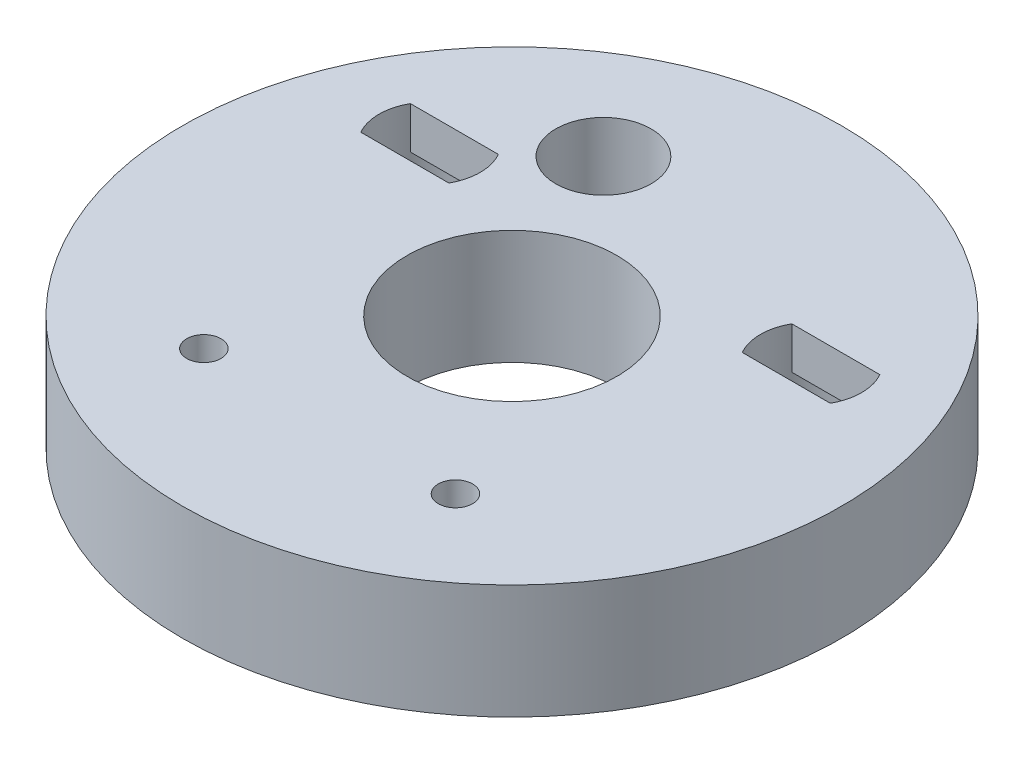
ISO-10303-21;
HEADER;
FILE_DESCRIPTION(('STEP AP214'),'2;1');
FILE_NAME('part.step','',(''),(''),'','','');
FILE_SCHEMA(('AUTOMOTIVE_DESIGN { 1 0 10303 214 1 1 1 1 }'));
ENDSEC;
DATA;
#1=APPLICATION_CONTEXT('core data for automotive mechanical design processes');
#2=APPLICATION_PROTOCOL_DEFINITION('international standard','automotive_design',2000,#1);
#3=PRODUCT_CONTEXT('',#1,'mechanical');
#4=PRODUCT('Part','Part','',(#3));
#5=PRODUCT_RELATED_PRODUCT_CATEGORY('part','',(#4));
#6=PRODUCT_DEFINITION_FORMATION('','',#4);
#7=PRODUCT_DEFINITION_CONTEXT('part definition',#1,'design');
#8=PRODUCT_DEFINITION('design','',#6,#7);
#9=PRODUCT_DEFINITION_SHAPE('','',#8);
#10=(LENGTH_UNIT() NAMED_UNIT(*) SI_UNIT(.MILLI.,.METRE.));
#11=(NAMED_UNIT(*) PLANE_ANGLE_UNIT() SI_UNIT($,.RADIAN.));
#12=(NAMED_UNIT(*) SI_UNIT($,.STERADIAN.) SOLID_ANGLE_UNIT());
#13=UNCERTAINTY_MEASURE_WITH_UNIT(LENGTH_MEASURE(1.E-05),#10,'distance_accuracy_value','');
#14=(GEOMETRIC_REPRESENTATION_CONTEXT(3) GLOBAL_UNCERTAINTY_ASSIGNED_CONTEXT((#13)) GLOBAL_UNIT_ASSIGNED_CONTEXT((#10,
#11,#12)) REPRESENTATION_CONTEXT('',''));
#15=CARTESIAN_POINT('',(0.,0.,0.));
#16=DIRECTION('',(0.,0.,1.));
#17=DIRECTION('',(1.,0.,0.));
#18=AXIS2_PLACEMENT_3D('',#15,#16,#17);
#19=CARTESIAN_POINT('',(0.,0.,0.));
#20=DIRECTION('',(0.,1.,0.));
#21=DIRECTION('',(0.,0.,1.));
#22=AXIS2_PLACEMENT_3D('',#19,#20,#21);
#23=PLANE('',#22);
#24=CARTESIAN_POINT('',(-4.85,0.,-9.64469956572096));
#25=DIRECTION('',(0.,1.,0.));
#26=DIRECTION('',(0.,0.,1.));
#27=AXIS2_PLACEMENT_3D('',#24,#25,#26);
#28=CIRCLE('',#27,2.5);
#29=CARTESIAN_POINT('',(-4.85,0.,-7.14469956572096));
#30=VERTEX_POINT('',#29);
#31=EDGE_CURVE('E173',#30,#30,#28,.T.);
#32=ORIENTED_EDGE('',*,*,#31,.T.);
#33=EDGE_LOOP('',(#32));
#34=FACE_BOUND('',#33,.T.);
#35=CARTESIAN_POINT('',(0.,0.,0.));
#36=DIRECTION('',(0.,1.,0.));
#37=DIRECTION('',(0.,0.,1.));
#38=AXIS2_PLACEMENT_3D('',#35,#36,#37);
#39=CIRCLE('',#38,17.28);
#40=CARTESIAN_POINT('',(0.,0.,-17.28));
#41=VERTEX_POINT('',#40);
#42=EDGE_CURVE('E11',#41,#41,#39,.T.);
#43=ORIENTED_EDGE('',*,*,#42,.F.);
#44=EDGE_LOOP('',(#43));
#45=FACE_BOUND('',#44,.T.);
#46=CARTESIAN_POINT('',(0.,0.,0.));
#47=DIRECTION('',(0.,1.,0.));
#48=DIRECTION('',(0.,0.,1.));
#49=AXIS2_PLACEMENT_3D('',#46,#47,#48);
#50=CIRCLE('',#49,5.5);
#51=CARTESIAN_POINT('',(0.,0.,-5.5));
#52=VERTEX_POINT('',#51);
#53=EDGE_CURVE('E43',#52,#52,#50,.T.);
#54=ORIENTED_EDGE('',*,*,#53,.T.);
#55=EDGE_LOOP('',(#54));
#56=FACE_BOUND('',#55,.T.);
#57=CARTESIAN_POINT('',(-6.595,0.,9.56109165419973));
#58=DIRECTION('',(0.,1.,0.));
#59=DIRECTION('',(0.,0.,1.));
#60=AXIS2_PLACEMENT_3D('',#57,#58,#59);
#61=CIRCLE('',#60,1.9);
#62=CARTESIAN_POINT('',(-6.595,0.,7.66109165419973));
#63=VERTEX_POINT('',#62);
#64=EDGE_CURVE('E195',#63,#63,#61,.T.);
#65=ORIENTED_EDGE('',*,*,#64,.T.);
#66=EDGE_LOOP('',(#65));
#67=FACE_BOUND('',#66,.T.);
#68=CARTESIAN_POINT('',(6.595,0.,9.56109165419973));
#69=DIRECTION('',(0.,1.,0.));
#70=DIRECTION('',(0.,0.,-1.));
#71=AXIS2_PLACEMENT_3D('',#68,#69,#70);
#72=CIRCLE('',#71,1.9);
#73=CARTESIAN_POINT('',(6.595,0.,7.66109165419973));
#74=VERTEX_POINT('',#73);
#75=EDGE_CURVE('E192',#74,#74,#72,.T.);
#76=ORIENTED_EDGE('',*,*,#75,.T.);
#77=EDGE_LOOP('',(#76));
#78=FACE_BOUND('',#77,.T.);
#79=CARTESIAN_POINT('',(10.,0.,-5.67890834580027));
#80=DIRECTION('',(0.,1.,0.));
#81=DIRECTION('',(0.,0.,-1.));
#82=AXIS2_PLACEMENT_3D('',#79,#80,#81);
#83=CIRCLE('',#82,2.65);
#84=CARTESIAN_POINT('',(10.,0.,-8.32890834580027));
#85=VERTEX_POINT('',#84);
#86=EDGE_CURVE('E187',#85,#85,#83,.T.);
#87=ORIENTED_EDGE('',*,*,#86,.T.);
#88=EDGE_LOOP('',(#87));
#89=FACE_BOUND('',#88,.T.);
#90=CARTESIAN_POINT('',(-10.,0.,-5.67890834580027));
#91=DIRECTION('',(0.,1.,0.));
#92=DIRECTION('',(0.,0.,1.));
#93=AXIS2_PLACEMENT_3D('',#90,#91,#92);
#94=CIRCLE('',#93,2.65);
#95=CARTESIAN_POINT('',(-10.,0.,-3.02890834580027));
#96=VERTEX_POINT('',#95);
#97=EDGE_CURVE('E176',#96,#96,#94,.T.);
#98=ORIENTED_EDGE('',*,*,#97,.T.);
#99=EDGE_LOOP('',(#98));
#100=FACE_BOUND('',#99,.T.);
#101=ADVANCED_FACE('F35',(#34,#45,#56,#67,#78,#89,#100),#23,.F.);
#102=CARTESIAN_POINT('',(0.,3.8,0.));
#103=DIRECTION('',(0.,-1.,0.));
#104=DIRECTION('',(0.,0.,-1.));
#105=AXIS2_PLACEMENT_3D('',#102,#103,#104);
#106=CYLINDRICAL_SURFACE('',#105,17.28);
#107=CARTESIAN_POINT('',(0.,6.,0.));
#108=DIRECTION('',(0.,1.,0.));
#109=DIRECTION('',(0.,0.,1.));
#110=AXIS2_PLACEMENT_3D('',#107,#108,#109);
#111=CIRCLE('',#110,17.28);
#112=CARTESIAN_POINT('',(0.,6.,-17.28));
#113=VERTEX_POINT('',#112);
#114=EDGE_CURVE('E169',#113,#113,#111,.T.);
#115=CARTESIAN_POINT('',(0.,0.,-17.28));
#116=CARTESIAN_POINT('',(0.,0.0625000000000001,-17.28));
#117=CARTESIAN_POINT('',(0.,0.125,-17.28));
#118=CARTESIAN_POINT('',(0.,0.25,-17.28));
#119=CARTESIAN_POINT('',(0.,0.3125,-17.28));
#120=CARTESIAN_POINT('',(0.,0.4375,-17.28));
#121=CARTESIAN_POINT('',(0.,0.5,-17.28));
#122=CARTESIAN_POINT('',(0.,0.625,-17.28));
#123=CARTESIAN_POINT('',(0.,0.6875,-17.28));
#124=CARTESIAN_POINT('',(0.,0.8125,-17.28));
#125=CARTESIAN_POINT('',(0.,0.875,-17.28));
#126=CARTESIAN_POINT('',(0.,1.,-17.28));
#127=CARTESIAN_POINT('',(0.,1.0625,-17.28));
#128=CARTESIAN_POINT('',(0.,1.1875,-17.28));
#129=CARTESIAN_POINT('',(0.,1.25,-17.28));
#130=CARTESIAN_POINT('',(0.,1.375,-17.28));
#131=CARTESIAN_POINT('',(0.,1.4375,-17.28));
#132=CARTESIAN_POINT('',(0.,1.5625,-17.28));
#133=CARTESIAN_POINT('',(0.,1.625,-17.28));
#134=CARTESIAN_POINT('',(0.,1.75,-17.28));
#135=CARTESIAN_POINT('',(0.,1.8125,-17.28));
#136=CARTESIAN_POINT('',(0.,1.9375,-17.28));
#137=CARTESIAN_POINT('',(0.,2.,-17.28));
#138=CARTESIAN_POINT('',(0.,2.125,-17.28));
#139=CARTESIAN_POINT('',(0.,2.1875,-17.28));
#140=CARTESIAN_POINT('',(0.,2.3125,-17.28));
#141=CARTESIAN_POINT('',(0.,2.375,-17.28));
#142=CARTESIAN_POINT('',(0.,2.5,-17.28));
#143=CARTESIAN_POINT('',(0.,2.5625,-17.28));
#144=CARTESIAN_POINT('',(0.,2.6875,-17.28));
#145=CARTESIAN_POINT('',(0.,2.75,-17.28));
#146=CARTESIAN_POINT('',(0.,2.875,-17.28));
#147=CARTESIAN_POINT('',(0.,2.9375,-17.28));
#148=CARTESIAN_POINT('',(0.,3.0625,-17.28));
#149=CARTESIAN_POINT('',(0.,3.125,-17.28));
#150=CARTESIAN_POINT('',(0.,3.25,-17.28));
#151=CARTESIAN_POINT('',(0.,3.3125,-17.28));
#152=CARTESIAN_POINT('',(0.,3.4375,-17.28));
#153=CARTESIAN_POINT('',(0.,3.5,-17.28));
#154=CARTESIAN_POINT('',(0.,3.625,-17.28));
#155=CARTESIAN_POINT('',(0.,3.6875,-17.28));
#156=CARTESIAN_POINT('',(0.,3.8125,-17.28));
#157=CARTESIAN_POINT('',(0.,3.875,-17.28));
#158=CARTESIAN_POINT('',(0.,4.,-17.28));
#159=CARTESIAN_POINT('',(0.,4.0625,-17.28));
#160=CARTESIAN_POINT('',(0.,4.1875,-17.28));
#161=CARTESIAN_POINT('',(0.,4.25,-17.28));
#162=CARTESIAN_POINT('',(0.,4.375,-17.28));
#163=CARTESIAN_POINT('',(0.,4.4375,-17.28));
#164=CARTESIAN_POINT('',(0.,4.5625,-17.28));
#165=CARTESIAN_POINT('',(0.,4.625,-17.28));
#166=CARTESIAN_POINT('',(0.,4.75,-17.28));
#167=CARTESIAN_POINT('',(0.,4.8125,-17.28));
#168=CARTESIAN_POINT('',(0.,4.9375,-17.28));
#169=CARTESIAN_POINT('',(0.,5.,-17.28));
#170=CARTESIAN_POINT('',(0.,5.125,-17.28));
#171=CARTESIAN_POINT('',(0.,5.1875,-17.28));
#172=CARTESIAN_POINT('',(0.,5.3125,-17.28));
#173=CARTESIAN_POINT('',(0.,5.375,-17.28));
#174=CARTESIAN_POINT('',(0.,5.5,-17.28));
#175=CARTESIAN_POINT('',(0.,5.5625,-17.28));
#176=CARTESIAN_POINT('',(0.,5.6875,-17.28));
#177=CARTESIAN_POINT('',(0.,5.75,-17.28));
#178=CARTESIAN_POINT('',(0.,5.875,-17.28));
#179=CARTESIAN_POINT('',(0.,5.9375,-17.28));
#180=CARTESIAN_POINT('',(0.,6.,-17.28));
#181=B_SPLINE_CURVE_WITH_KNOTS('',3,(#115,#116,#117,#118,#119,#120,#121,#122,#123,#124,#125,
#126,#127,#128,#129,#130,#131,#132,#133,#134,#135,#136,#137,#138,#139,#140,#141,#142,#143,#144,
#145,#146,#147,#148,#149,#150,#151,#152,#153,#154,#155,#156,#157,#158,#159,#160,#161,#162,#163,
#164,#165,#166,#167,#168,#169,#170,#171,#172,#173,#174,#175,#176,#177,#178,#179,#180),
.UNSPECIFIED.,.F.,.F.,(4,2,2,2,2,2,2,2,2,2,2,2,2,2,2,2,2,2,2,2,2,2,2,2,2,2,2,2,2,2,2,2,4),(0.,
0.1875,0.375,0.5625,0.75,0.9375,1.125,1.3125,1.5,1.6875,1.875,2.0625,2.25,2.4375,2.625,2.8125,
3.,3.1875,3.375,3.5625,3.75,3.9375,4.125,4.3125,4.5,4.6875,4.875,5.0625,5.25,5.4375,5.625,
5.8125,6.),.UNSPECIFIED.);
#182=EDGE_CURVE('BSEAM37',#41,#113,#181,.T.);
#183=ORIENTED_EDGE('',*,*,#42,.T.);
#184=ORIENTED_EDGE('',*,*,#114,.F.);
#185=ORIENTED_EDGE('',*,*,#182,.T.);
#186=ORIENTED_EDGE('',*,*,#182,.F.);
#187=EDGE_LOOP('',(#183,#185,#184,#186));
#188=FACE_BOUND('',#187,.T.);
#189=ADVANCED_FACE('F37',(#188),#106,.T.);
#190=CARTESIAN_POINT('',(0.,3.8,0.));
#191=DIRECTION('',(0.,-1.,0.));
#192=DIRECTION('',(0.,0.,-1.));
#193=AXIS2_PLACEMENT_3D('',#190,#191,#192);
#194=CYLINDRICAL_SURFACE('',#193,5.5);
#195=CARTESIAN_POINT('',(0.,6.,0.));
#196=DIRECTION('',(0.,1.,0.));
#197=DIRECTION('',(0.,0.,1.));
#198=AXIS2_PLACEMENT_3D('',#195,#196,#197);
#199=CIRCLE('',#198,5.5);
#200=CARTESIAN_POINT('',(0.,6.,-5.5));
#201=VERTEX_POINT('',#200);
#202=EDGE_CURVE('E143',#201,#201,#199,.T.);
#203=CARTESIAN_POINT('',(0.,0.,-5.5));
#204=CARTESIAN_POINT('',(0.,0.0625000000000001,-5.5));
#205=CARTESIAN_POINT('',(0.,0.125,-5.5));
#206=CARTESIAN_POINT('',(0.,0.25,-5.5));
#207=CARTESIAN_POINT('',(0.,0.3125,-5.5));
#208=CARTESIAN_POINT('',(0.,0.4375,-5.5));
#209=CARTESIAN_POINT('',(0.,0.5,-5.5));
#210=CARTESIAN_POINT('',(0.,0.625,-5.5));
#211=CARTESIAN_POINT('',(0.,0.6875,-5.5));
#212=CARTESIAN_POINT('',(0.,0.8125,-5.5));
#213=CARTESIAN_POINT('',(0.,0.875,-5.5));
#214=CARTESIAN_POINT('',(0.,1.,-5.5));
#215=CARTESIAN_POINT('',(0.,1.0625,-5.5));
#216=CARTESIAN_POINT('',(0.,1.1875,-5.5));
#217=CARTESIAN_POINT('',(0.,1.25,-5.5));
#218=CARTESIAN_POINT('',(0.,1.375,-5.5));
#219=CARTESIAN_POINT('',(0.,1.4375,-5.5));
#220=CARTESIAN_POINT('',(0.,1.5625,-5.5));
#221=CARTESIAN_POINT('',(0.,1.625,-5.5));
#222=CARTESIAN_POINT('',(0.,1.75,-5.5));
#223=CARTESIAN_POINT('',(0.,1.8125,-5.5));
#224=CARTESIAN_POINT('',(0.,1.9375,-5.5));
#225=CARTESIAN_POINT('',(0.,2.,-5.5));
#226=CARTESIAN_POINT('',(0.,2.125,-5.5));
#227=CARTESIAN_POINT('',(0.,2.1875,-5.5));
#228=CARTESIAN_POINT('',(0.,2.3125,-5.5));
#229=CARTESIAN_POINT('',(0.,2.375,-5.5));
#230=CARTESIAN_POINT('',(0.,2.5,-5.5));
#231=CARTESIAN_POINT('',(0.,2.5625,-5.5));
#232=CARTESIAN_POINT('',(0.,2.6875,-5.5));
#233=CARTESIAN_POINT('',(0.,2.75,-5.5));
#234=CARTESIAN_POINT('',(0.,2.875,-5.5));
#235=CARTESIAN_POINT('',(0.,2.9375,-5.5));
#236=CARTESIAN_POINT('',(0.,3.0625,-5.5));
#237=CARTESIAN_POINT('',(0.,3.125,-5.5));
#238=CARTESIAN_POINT('',(0.,3.25,-5.5));
#239=CARTESIAN_POINT('',(0.,3.3125,-5.5));
#240=CARTESIAN_POINT('',(0.,3.4375,-5.5));
#241=CARTESIAN_POINT('',(0.,3.5,-5.5));
#242=CARTESIAN_POINT('',(0.,3.625,-5.5));
#243=CARTESIAN_POINT('',(0.,3.6875,-5.5));
#244=CARTESIAN_POINT('',(0.,3.8125,-5.5));
#245=CARTESIAN_POINT('',(0.,3.875,-5.5));
#246=CARTESIAN_POINT('',(0.,4.,-5.5));
#247=CARTESIAN_POINT('',(0.,4.0625,-5.5));
#248=CARTESIAN_POINT('',(0.,4.1875,-5.5));
#249=CARTESIAN_POINT('',(0.,4.25,-5.5));
#250=CARTESIAN_POINT('',(0.,4.375,-5.5));
#251=CARTESIAN_POINT('',(0.,4.4375,-5.5));
#252=CARTESIAN_POINT('',(0.,4.5625,-5.5));
#253=CARTESIAN_POINT('',(0.,4.625,-5.5));
#254=CARTESIAN_POINT('',(0.,4.75,-5.5));
#255=CARTESIAN_POINT('',(0.,4.8125,-5.5));
#256=CARTESIAN_POINT('',(0.,4.9375,-5.5));
#257=CARTESIAN_POINT('',(0.,5.,-5.5));
#258=CARTESIAN_POINT('',(0.,5.125,-5.5));
#259=CARTESIAN_POINT('',(0.,5.1875,-5.5));
#260=CARTESIAN_POINT('',(0.,5.3125,-5.5));
#261=CARTESIAN_POINT('',(0.,5.375,-5.5));
#262=CARTESIAN_POINT('',(0.,5.5,-5.5));
#263=CARTESIAN_POINT('',(0.,5.5625,-5.5));
#264=CARTESIAN_POINT('',(0.,5.6875,-5.5));
#265=CARTESIAN_POINT('',(0.,5.75,-5.5));
#266=CARTESIAN_POINT('',(0.,5.875,-5.5));
#267=CARTESIAN_POINT('',(0.,5.9375,-5.5));
#268=CARTESIAN_POINT('',(0.,6.,-5.5));
#269=B_SPLINE_CURVE_WITH_KNOTS('',3,(#203,#204,#205,#206,#207,#208,#209,#210,#211,#212,#213,
#214,#215,#216,#217,#218,#219,#220,#221,#222,#223,#224,#225,#226,#227,#228,#229,#230,#231,#232,
#233,#234,#235,#236,#237,#238,#239,#240,#241,#242,#243,#244,#245,#246,#247,#248,#249,#250,#251,
#252,#253,#254,#255,#256,#257,#258,#259,#260,#261,#262,#263,#264,#265,#266,#267,#268),
.UNSPECIFIED.,.F.,.F.,(4,2,2,2,2,2,2,2,2,2,2,2,2,2,2,2,2,2,2,2,2,2,2,2,2,2,2,2,2,2,2,2,4),(0.,
0.1875,0.375,0.5625,0.75,0.9375,1.125,1.3125,1.5,1.6875,1.875,2.0625,2.25,2.4375,2.625,2.8125,
3.,3.1875,3.375,3.5625,3.75,3.9375,4.125,4.3125,4.5,4.6875,4.875,5.0625,5.25,5.4375,5.625,
5.8125,6.),.UNSPECIFIED.);
#270=EDGE_CURVE('BSEAM204',#52,#201,#269,.T.);
#271=ORIENTED_EDGE('',*,*,#53,.F.);
#272=ORIENTED_EDGE('',*,*,#202,.T.);
#273=ORIENTED_EDGE('',*,*,#270,.T.);
#274=ORIENTED_EDGE('',*,*,#270,.F.);
#275=EDGE_LOOP('',(#271,#273,#272,#274));
#276=FACE_BOUND('',#275,.T.);
#277=ADVANCED_FACE('F204',(#276),#194,.F.);
#278=CARTESIAN_POINT('',(-6.595,3.8,9.56109165419973));
#279=DIRECTION('',(0.,-1.,0.));
#280=DIRECTION('',(0.,0.,-1.));
#281=AXIS2_PLACEMENT_3D('',#278,#279,#280);
#282=CYLINDRICAL_SURFACE('',#281,1.9);
#283=CARTESIAN_POINT('',(-6.595,3.8,9.56109165419973));
#284=DIRECTION('',(0.,1.,0.));
#285=DIRECTION('',(0.,0.,1.));
#286=AXIS2_PLACEMENT_3D('',#283,#284,#285);
#287=CIRCLE('',#286,1.9);
#288=CARTESIAN_POINT('',(-6.595,3.8,7.66109165419973));
#289=VERTEX_POINT('',#288);
#290=EDGE_CURVE('E177',#289,#289,#287,.T.);
#291=CARTESIAN_POINT('',(-6.595,3.8,7.66109165419973));
#292=CARTESIAN_POINT('',(-6.595,3.76041666666667,7.66109165419973));
#293=CARTESIAN_POINT('',(-6.595,3.72083333333333,7.66109165419973));
#294=CARTESIAN_POINT('',(-6.595,3.64166666666667,7.66109165419973));
#295=CARTESIAN_POINT('',(-6.595,3.60208333333333,7.66109165419973));
#296=CARTESIAN_POINT('',(-6.595,3.52291666666667,7.66109165419973));
#297=CARTESIAN_POINT('',(-6.595,3.48333333333333,7.66109165419973));
#298=CARTESIAN_POINT('',(-6.595,3.40416666666667,7.66109165419973));
#299=CARTESIAN_POINT('',(-6.595,3.36458333333333,7.66109165419973));
#300=CARTESIAN_POINT('',(-6.595,3.28541666666667,7.66109165419973));
#301=CARTESIAN_POINT('',(-6.595,3.24583333333333,7.66109165419973));
#302=CARTESIAN_POINT('',(-6.595,3.16666666666667,7.66109165419973));
#303=CARTESIAN_POINT('',(-6.595,3.12708333333333,7.66109165419973));
#304=CARTESIAN_POINT('',(-6.595,3.04791666666667,7.66109165419973));
#305=CARTESIAN_POINT('',(-6.595,3.00833333333333,7.66109165419973));
#306=CARTESIAN_POINT('',(-6.595,2.92916666666667,7.66109165419973));
#307=CARTESIAN_POINT('',(-6.595,2.88958333333333,7.66109165419973));
#308=CARTESIAN_POINT('',(-6.595,2.81041666666667,7.66109165419973));
#309=CARTESIAN_POINT('',(-6.595,2.77083333333333,7.66109165419973));
#310=CARTESIAN_POINT('',(-6.595,2.69166666666667,7.66109165419973));
#311=CARTESIAN_POINT('',(-6.595,2.65208333333333,7.66109165419973));
#312=CARTESIAN_POINT('',(-6.595,2.57291666666667,7.66109165419973));
#313=CARTESIAN_POINT('',(-6.595,2.53333333333333,7.66109165419973));
#314=CARTESIAN_POINT('',(-6.595,2.45416666666667,7.66109165419973));
#315=CARTESIAN_POINT('',(-6.595,2.41458333333333,7.66109165419973));
#316=CARTESIAN_POINT('',(-6.595,2.33541666666667,7.66109165419973));
#317=CARTESIAN_POINT('',(-6.595,2.29583333333333,7.66109165419973));
#318=CARTESIAN_POINT('',(-6.595,2.21666666666667,7.66109165419973));
#319=CARTESIAN_POINT('',(-6.595,2.17708333333333,7.66109165419973));
#320=CARTESIAN_POINT('',(-6.595,2.09791666666667,7.66109165419973));
#321=CARTESIAN_POINT('',(-6.595,2.05833333333333,7.66109165419973));
#322=CARTESIAN_POINT('',(-6.595,1.97916666666667,7.66109165419973));
#323=CARTESIAN_POINT('',(-6.595,1.93958333333333,7.66109165419973));
#324=CARTESIAN_POINT('',(-6.595,1.86041666666667,7.66109165419973));
#325=CARTESIAN_POINT('',(-6.595,1.82083333333333,7.66109165419973));
#326=CARTESIAN_POINT('',(-6.595,1.74166666666667,7.66109165419973));
#327=CARTESIAN_POINT('',(-6.595,1.70208333333333,7.66109165419973));
#328=CARTESIAN_POINT('',(-6.595,1.62291666666667,7.66109165419973));
#329=CARTESIAN_POINT('',(-6.595,1.58333333333333,7.66109165419973));
#330=CARTESIAN_POINT('',(-6.595,1.50416666666667,7.66109165419973));
#331=CARTESIAN_POINT('',(-6.595,1.46458333333333,7.66109165419973));
#332=CARTESIAN_POINT('',(-6.595,1.38541666666667,7.66109165419973));
#333=CARTESIAN_POINT('',(-6.595,1.34583333333333,7.66109165419973));
#334=CARTESIAN_POINT('',(-6.595,1.26666666666667,7.66109165419973));
#335=CARTESIAN_POINT('',(-6.595,1.22708333333333,7.66109165419973));
#336=CARTESIAN_POINT('',(-6.595,1.14791666666667,7.66109165419973));
#337=CARTESIAN_POINT('',(-6.595,1.10833333333333,7.66109165419973));
#338=CARTESIAN_POINT('',(-6.595,1.02916666666667,7.66109165419973));
#339=CARTESIAN_POINT('',(-6.595,0.989583333333334,7.66109165419973));
#340=CARTESIAN_POINT('',(-6.595,0.910416666666667,7.66109165419973));
#341=CARTESIAN_POINT('',(-6.595,0.870833333333333,7.66109165419973));
#342=CARTESIAN_POINT('',(-6.595,0.791666666666667,7.66109165419973));
#343=CARTESIAN_POINT('',(-6.595,0.752083333333333,7.66109165419973));
#344=CARTESIAN_POINT('',(-6.595,0.672916666666667,7.66109165419973));
#345=CARTESIAN_POINT('',(-6.595,0.633333333333333,7.66109165419973));
#346=CARTESIAN_POINT('',(-6.595,0.554166666666667,7.66109165419973));
#347=CARTESIAN_POINT('',(-6.595,0.514583333333334,7.66109165419973));
#348=CARTESIAN_POINT('',(-6.595,0.435416666666667,7.66109165419973));
#349=CARTESIAN_POINT('',(-6.595,0.395833333333334,7.66109165419973));
#350=CARTESIAN_POINT('',(-6.595,0.316666666666667,7.66109165419973));
#351=CARTESIAN_POINT('',(-6.595,0.277083333333333,7.66109165419973));
#352=CARTESIAN_POINT('',(-6.595,0.197916666666667,7.66109165419973));
#353=CARTESIAN_POINT('',(-6.595,0.158333333333333,7.66109165419973));
#354=CARTESIAN_POINT('',(-6.595,0.0791666666666666,7.66109165419973));
#355=CARTESIAN_POINT('',(-6.595,0.0395833333333333,7.66109165419973));
#356=CARTESIAN_POINT('',(-6.595,0.,7.66109165419973));
#357=B_SPLINE_CURVE_WITH_KNOTS('',3,(#291,#292,#293,#294,#295,#296,#297,#298,#299,#300,#301,
#302,#303,#304,#305,#306,#307,#308,#309,#310,#311,#312,#313,#314,#315,#316,#317,#318,#319,#320,
#321,#322,#323,#324,#325,#326,#327,#328,#329,#330,#331,#332,#333,#334,#335,#336,#337,#338,#339,
#340,#341,#342,#343,#344,#345,#346,#347,#348,#349,#350,#351,#352,#353,#354,#355,#356),
.UNSPECIFIED.,.F.,.F.,(4,2,2,2,2,2,2,2,2,2,2,2,2,2,2,2,2,2,2,2,2,2,2,2,2,2,2,2,2,2,2,2,4),(0.,
0.11875,0.2375,0.35625,0.475,0.59375,0.7125,0.83125,0.95,1.06875,1.1875,1.30625,1.425,1.54375,
1.6625,1.78125,1.9,2.01875,2.1375,2.25625,2.375,2.49375,2.6125,2.73125,2.85,2.96875,3.0875,
3.20625,3.325,3.44375,3.5625,3.68125,3.8),.UNSPECIFIED.);
#358=EDGE_CURVE('BSEAM207',#289,#63,#357,.T.);
#359=ORIENTED_EDGE('',*,*,#290,.T.);
#360=ORIENTED_EDGE('',*,*,#64,.F.);
#361=ORIENTED_EDGE('',*,*,#358,.T.);
#362=ORIENTED_EDGE('',*,*,#358,.F.);
#363=EDGE_LOOP('',(#359,#361,#360,#362));
#364=FACE_BOUND('',#363,.T.);
#365=ADVANCED_FACE('F207',(#364),#282,.F.);
#366=CARTESIAN_POINT('',(6.595,3.8,9.56109165419973));
#367=DIRECTION('',(0.,-1.,0.));
#368=DIRECTION('',(0.,0.,-1.));
#369=AXIS2_PLACEMENT_3D('',#366,#367,#368);
#370=CYLINDRICAL_SURFACE('',#369,1.9);
#371=CARTESIAN_POINT('',(6.595,3.8,9.56109165419973));
#372=DIRECTION('',(0.,1.,0.));
#373=DIRECTION('',(0.,0.,-1.));
#374=AXIS2_PLACEMENT_3D('',#371,#372,#373);
#375=CIRCLE('',#374,1.9);
#376=CARTESIAN_POINT('',(6.595,3.8,7.66109165419973));
#377=VERTEX_POINT('',#376);
#378=EDGE_CURVE('E172',#377,#377,#375,.T.);
#379=CARTESIAN_POINT('',(6.595,3.8,7.66109165419973));
#380=CARTESIAN_POINT('',(6.595,3.76041666666667,7.66109165419973));
#381=CARTESIAN_POINT('',(6.595,3.72083333333333,7.66109165419973));
#382=CARTESIAN_POINT('',(6.595,3.64166666666667,7.66109165419973));
#383=CARTESIAN_POINT('',(6.595,3.60208333333333,7.66109165419973));
#384=CARTESIAN_POINT('',(6.595,3.52291666666667,7.66109165419973));
#385=CARTESIAN_POINT('',(6.595,3.48333333333333,7.66109165419973));
#386=CARTESIAN_POINT('',(6.595,3.40416666666667,7.66109165419973));
#387=CARTESIAN_POINT('',(6.595,3.36458333333333,7.66109165419973));
#388=CARTESIAN_POINT('',(6.595,3.28541666666667,7.66109165419973));
#389=CARTESIAN_POINT('',(6.595,3.24583333333333,7.66109165419973));
#390=CARTESIAN_POINT('',(6.595,3.16666666666667,7.66109165419973));
#391=CARTESIAN_POINT('',(6.595,3.12708333333333,7.66109165419973));
#392=CARTESIAN_POINT('',(6.595,3.04791666666667,7.66109165419973));
#393=CARTESIAN_POINT('',(6.595,3.00833333333333,7.66109165419973));
#394=CARTESIAN_POINT('',(6.595,2.92916666666667,7.66109165419973));
#395=CARTESIAN_POINT('',(6.595,2.88958333333333,7.66109165419973));
#396=CARTESIAN_POINT('',(6.595,2.81041666666667,7.66109165419973));
#397=CARTESIAN_POINT('',(6.595,2.77083333333333,7.66109165419973));
#398=CARTESIAN_POINT('',(6.595,2.69166666666667,7.66109165419973));
#399=CARTESIAN_POINT('',(6.595,2.65208333333333,7.66109165419973));
#400=CARTESIAN_POINT('',(6.595,2.57291666666667,7.66109165419973));
#401=CARTESIAN_POINT('',(6.595,2.53333333333333,7.66109165419973));
#402=CARTESIAN_POINT('',(6.595,2.45416666666667,7.66109165419973));
#403=CARTESIAN_POINT('',(6.595,2.41458333333333,7.66109165419973));
#404=CARTESIAN_POINT('',(6.595,2.33541666666667,7.66109165419973));
#405=CARTESIAN_POINT('',(6.595,2.29583333333333,7.66109165419973));
#406=CARTESIAN_POINT('',(6.595,2.21666666666667,7.66109165419973));
#407=CARTESIAN_POINT('',(6.595,2.17708333333333,7.66109165419973));
#408=CARTESIAN_POINT('',(6.595,2.09791666666667,7.66109165419973));
#409=CARTESIAN_POINT('',(6.595,2.05833333333333,7.66109165419973));
#410=CARTESIAN_POINT('',(6.595,1.97916666666667,7.66109165419973));
#411=CARTESIAN_POINT('',(6.595,1.93958333333333,7.66109165419973));
#412=CARTESIAN_POINT('',(6.595,1.86041666666667,7.66109165419973));
#413=CARTESIAN_POINT('',(6.595,1.82083333333333,7.66109165419973));
#414=CARTESIAN_POINT('',(6.595,1.74166666666667,7.66109165419973));
#415=CARTESIAN_POINT('',(6.595,1.70208333333333,7.66109165419973));
#416=CARTESIAN_POINT('',(6.595,1.62291666666667,7.66109165419973));
#417=CARTESIAN_POINT('',(6.595,1.58333333333333,7.66109165419973));
#418=CARTESIAN_POINT('',(6.595,1.50416666666667,7.66109165419973));
#419=CARTESIAN_POINT('',(6.595,1.46458333333333,7.66109165419973));
#420=CARTESIAN_POINT('',(6.595,1.38541666666667,7.66109165419973));
#421=CARTESIAN_POINT('',(6.595,1.34583333333333,7.66109165419973));
#422=CARTESIAN_POINT('',(6.595,1.26666666666667,7.66109165419973));
#423=CARTESIAN_POINT('',(6.595,1.22708333333333,7.66109165419973));
#424=CARTESIAN_POINT('',(6.595,1.14791666666667,7.66109165419973));
#425=CARTESIAN_POINT('',(6.595,1.10833333333333,7.66109165419973));
#426=CARTESIAN_POINT('',(6.595,1.02916666666667,7.66109165419973));
#427=CARTESIAN_POINT('',(6.595,0.989583333333334,7.66109165419973));
#428=CARTESIAN_POINT('',(6.595,0.910416666666667,7.66109165419973));
#429=CARTESIAN_POINT('',(6.595,0.870833333333333,7.66109165419973));
#430=CARTESIAN_POINT('',(6.595,0.791666666666667,7.66109165419973));
#431=CARTESIAN_POINT('',(6.595,0.752083333333333,7.66109165419973));
#432=CARTESIAN_POINT('',(6.595,0.672916666666667,7.66109165419973));
#433=CARTESIAN_POINT('',(6.595,0.633333333333333,7.66109165419973));
#434=CARTESIAN_POINT('',(6.595,0.554166666666667,7.66109165419973));
#435=CARTESIAN_POINT('',(6.595,0.514583333333334,7.66109165419973));
#436=CARTESIAN_POINT('',(6.595,0.435416666666667,7.66109165419973));
#437=CARTESIAN_POINT('',(6.595,0.395833333333334,7.66109165419973));
#438=CARTESIAN_POINT('',(6.595,0.316666666666667,7.66109165419973));
#439=CARTESIAN_POINT('',(6.595,0.277083333333333,7.66109165419973));
#440=CARTESIAN_POINT('',(6.595,0.197916666666667,7.66109165419973));
#441=CARTESIAN_POINT('',(6.595,0.158333333333333,7.66109165419973));
#442=CARTESIAN_POINT('',(6.595,0.0791666666666666,7.66109165419973));
#443=CARTESIAN_POINT('',(6.595,0.0395833333333333,7.66109165419973));
#444=CARTESIAN_POINT('',(6.595,0.,7.66109165419973));
#445=B_SPLINE_CURVE_WITH_KNOTS('',3,(#379,#380,#381,#382,#383,#384,#385,#386,#387,#388,#389,
#390,#391,#392,#393,#394,#395,#396,#397,#398,#399,#400,#401,#402,#403,#404,#405,#406,#407,#408,
#409,#410,#411,#412,#413,#414,#415,#416,#417,#418,#419,#420,#421,#422,#423,#424,#425,#426,#427,
#428,#429,#430,#431,#432,#433,#434,#435,#436,#437,#438,#439,#440,#441,#442,#443,#444),
.UNSPECIFIED.,.F.,.F.,(4,2,2,2,2,2,2,2,2,2,2,2,2,2,2,2,2,2,2,2,2,2,2,2,2,2,2,2,2,2,2,2,4),(0.,
0.11875,0.2375,0.35625,0.475,0.59375,0.7125,0.83125,0.95,1.06875,1.1875,1.30625,1.425,1.54375,
1.6625,1.78125,1.9,2.01875,2.1375,2.25625,2.375,2.49375,2.6125,2.73125,2.85,2.96875,3.0875,
3.20625,3.325,3.44375,3.5625,3.68125,3.8),.UNSPECIFIED.);
#446=EDGE_CURVE('BSEAM250',#377,#74,#445,.T.);
#447=ORIENTED_EDGE('',*,*,#378,.T.);
#448=ORIENTED_EDGE('',*,*,#75,.F.);
#449=ORIENTED_EDGE('',*,*,#446,.T.);
#450=ORIENTED_EDGE('',*,*,#446,.F.);
#451=EDGE_LOOP('',(#447,#449,#448,#450));
#452=FACE_BOUND('',#451,.T.);
#453=ADVANCED_FACE('F250',(#452),#370,.F.);
#454=CARTESIAN_POINT('',(10.,3.8,-5.67890834580027));
#455=DIRECTION('',(0.,-1.,0.));
#456=DIRECTION('',(0.,0.,-1.));
#457=AXIS2_PLACEMENT_3D('',#454,#455,#456);
#458=CYLINDRICAL_SURFACE('',#457,2.65);
#459=CARTESIAN_POINT('',(10.,3.8,-5.67890834580027));
#460=DIRECTION('',(0.,1.,0.));
#461=DIRECTION('',(0.,0.,-1.));
#462=AXIS2_PLACEMENT_3D('',#459,#460,#461);
#463=CIRCLE('',#462,2.65);
#464=CARTESIAN_POINT('',(12.3092206477511,3.8,-6.97890834580027));
#465=VERTEX_POINT('',#464);
#466=CARTESIAN_POINT('',(7.6907793522489,3.8,-6.97890834580027));
#467=VERTEX_POINT('',#466);
#468=EDGE_CURVE('E183',#465,#467,#463,.T.);
#469=ORIENTED_EDGE('',*,*,#468,.T.);
#470=DIRECTION('',(0.,-1.,0.));
#471=VECTOR('',#470,1.);
#472=CARTESIAN_POINT('',(7.6907793522489,6.,-6.97890834580027));
#473=LINE('',#472,#471);
#474=CARTESIAN_POINT('',(7.6907793522489,6.,-6.97890834580027));
#475=VERTEX_POINT('',#474);
#476=EDGE_CURVE('E156',#475,#467,#473,.T.);
#477=ORIENTED_EDGE('',*,*,#476,.F.);
#478=CARTESIAN_POINT('',(10.,6.,-5.67890834580027));
#479=DIRECTION('',(0.,1.,0.));
#480=DIRECTION('',(0.,0.,-1.));
#481=AXIS2_PLACEMENT_3D('',#478,#479,#480);
#482=CIRCLE('',#481,2.65);
#483=CARTESIAN_POINT('',(7.6907793522489,6.,-4.37890834580027));
#484=VERTEX_POINT('',#483);
#485=EDGE_CURVE('E147',#475,#484,#482,.T.);
#486=ORIENTED_EDGE('',*,*,#485,.T.);
#487=DIRECTION('',(0.,-1.,0.));
#488=VECTOR('',#487,1.);
#489=CARTESIAN_POINT('',(7.6907793522489,6.,-4.37890834580027));
#490=LINE('',#489,#488);
#491=CARTESIAN_POINT('',(7.6907793522489,3.8,-4.37890834580027));
#492=VERTEX_POINT('',#491);
#493=EDGE_CURVE('E166',#484,#492,#490,.T.);
#494=ORIENTED_EDGE('',*,*,#493,.T.);
#495=CARTESIAN_POINT('',(12.3092206477511,3.8,-4.37890834580027));
#496=VERTEX_POINT('',#495);
#497=EDGE_CURVE('E186',#492,#496,#463,.T.);
#498=ORIENTED_EDGE('',*,*,#497,.T.);
#499=DIRECTION('',(0.,-1.,0.));
#500=VECTOR('',#499,1.);
#501=CARTESIAN_POINT('',(12.3092206477511,6.,-4.37890834580027));
#502=LINE('',#501,#500);
#503=CARTESIAN_POINT('',(12.3092206477511,6.,-4.37890834580027));
#504=VERTEX_POINT('',#503);
#505=EDGE_CURVE('E164',#504,#496,#502,.T.);
#506=ORIENTED_EDGE('',*,*,#505,.F.);
#507=CARTESIAN_POINT('',(10.,6.,-5.67890834580027));
#508=DIRECTION('',(0.,1.,0.));
#509=DIRECTION('',(0.,0.,-1.));
#510=AXIS2_PLACEMENT_3D('',#507,#508,#509);
#511=CIRCLE('',#510,2.65);
#512=CARTESIAN_POINT('',(12.3092206477511,6.,-6.97890834580027));
#513=VERTEX_POINT('',#512);
#514=EDGE_CURVE('E151',#504,#513,#511,.T.);
#515=ORIENTED_EDGE('',*,*,#514,.T.);
#516=DIRECTION('',(0.,-1.,0.));
#517=VECTOR('',#516,1.);
#518=CARTESIAN_POINT('',(12.3092206477511,6.,-6.97890834580027));
#519=LINE('',#518,#517);
#520=EDGE_CURVE('E161',#513,#465,#519,.T.);
#521=ORIENTED_EDGE('',*,*,#520,.T.);
#522=EDGE_LOOP('',(#469,#477,#486,#494,#498,#506,#515,#521));
#523=FACE_BOUND('',#522,.T.);
#524=ORIENTED_EDGE('',*,*,#86,.F.);
#525=EDGE_LOOP('',(#524));
#526=FACE_BOUND('',#525,.T.);
#527=ADVANCED_FACE('F237',(#523,#526),#458,.F.);
#528=CARTESIAN_POINT('',(-10.,3.8,-5.67890834580027));
#529=DIRECTION('',(0.,-1.,0.));
#530=DIRECTION('',(0.,0.,-1.));
#531=AXIS2_PLACEMENT_3D('',#528,#529,#530);
#532=CYLINDRICAL_SURFACE('',#531,2.65);
#533=CARTESIAN_POINT('',(-10.,3.8,-5.67890834580027));
#534=DIRECTION('',(0.,1.,0.));
#535=DIRECTION('',(0.,0.,1.));
#536=AXIS2_PLACEMENT_3D('',#533,#534,#535);
#537=CIRCLE('',#536,2.65);
#538=CARTESIAN_POINT('',(-12.3092206477511,3.8,-4.37890834580027));
#539=VERTEX_POINT('',#538);
#540=CARTESIAN_POINT('',(-7.6907793522489,3.8,-4.37890834580027));
#541=VERTEX_POINT('',#540);
#542=EDGE_CURVE('E178',#539,#541,#537,.T.);
#543=ORIENTED_EDGE('',*,*,#542,.T.);
#544=DIRECTION('',(0.,-1.,0.));
#545=VECTOR('',#544,1.);
#546=CARTESIAN_POINT('',(-7.6907793522489,6.,-4.37890834580027));
#547=LINE('',#546,#545);
#548=CARTESIAN_POINT('',(-7.6907793522489,6.,-4.37890834580027));
#549=VERTEX_POINT('',#548);
#550=EDGE_CURVE('E119',#549,#541,#547,.T.);
#551=ORIENTED_EDGE('',*,*,#550,.F.);
#552=CARTESIAN_POINT('',(-10.,6.,-5.67890834580027));
#553=DIRECTION('',(0.,1.,0.));
#554=DIRECTION('',(0.,0.,1.));
#555=AXIS2_PLACEMENT_3D('',#552,#553,#554);
#556=CIRCLE('',#555,2.65);
#557=CARTESIAN_POINT('',(-7.6907793522489,6.,-6.97890834580027));
#558=VERTEX_POINT('',#557);
#559=EDGE_CURVE('E125',#549,#558,#556,.T.);
#560=ORIENTED_EDGE('',*,*,#559,.T.);
#561=DIRECTION('',(0.,-1.,0.));
#562=VECTOR('',#561,1.);
#563=CARTESIAN_POINT('',(-7.6907793522489,6.,-6.97890834580027));
#564=LINE('',#563,#562);
#565=CARTESIAN_POINT('',(-7.6907793522489,3.8,-6.97890834580027));
#566=VERTEX_POINT('',#565);
#567=EDGE_CURVE('E137',#558,#566,#564,.T.);
#568=ORIENTED_EDGE('',*,*,#567,.T.);
#569=CARTESIAN_POINT('',(-12.3092206477511,3.8,-6.97890834580027));
#570=VERTEX_POINT('',#569);
#571=EDGE_CURVE('E180',#566,#570,#537,.T.);
#572=ORIENTED_EDGE('',*,*,#571,.T.);
#573=DIRECTION('',(0.,-1.,0.));
#574=VECTOR('',#573,1.);
#575=CARTESIAN_POINT('',(-12.3092206477511,6.,-6.97890834580027));
#576=LINE('',#575,#574);
#577=CARTESIAN_POINT('',(-12.3092206477511,6.,-6.97890834580027));
#578=VERTEX_POINT('',#577);
#579=EDGE_CURVE('E108',#578,#570,#576,.T.);
#580=ORIENTED_EDGE('',*,*,#579,.F.);
#581=CARTESIAN_POINT('',(-10.,6.,-5.67890834580027));
#582=DIRECTION('',(0.,1.,0.));
#583=DIRECTION('',(0.,0.,1.));
#584=AXIS2_PLACEMENT_3D('',#581,#582,#583);
#585=CIRCLE('',#584,2.65);
#586=CARTESIAN_POINT('',(-12.3092206477511,6.,-4.37890834580027));
#587=VERTEX_POINT('',#586);
#588=EDGE_CURVE('E101',#578,#587,#585,.T.);
#589=ORIENTED_EDGE('',*,*,#588,.T.);
#590=DIRECTION('',(0.,-1.,0.));
#591=VECTOR('',#590,1.);
#592=CARTESIAN_POINT('',(-12.3092206477511,6.,-4.37890834580027));
#593=LINE('',#592,#591);
#594=EDGE_CURVE('E106',#587,#539,#593,.T.);
#595=ORIENTED_EDGE('',*,*,#594,.T.);
#596=EDGE_LOOP('',(#543,#551,#560,#568,#572,#580,#589,#595));
#597=FACE_BOUND('',#596,.T.);
#598=ORIENTED_EDGE('',*,*,#97,.F.);
#599=EDGE_LOOP('',(#598));
#600=FACE_BOUND('',#599,.T.);
#601=ADVANCED_FACE('F104',(#597,#600),#532,.F.);
#602=CARTESIAN_POINT('',(-4.85,0.,-9.64469956572096));
#603=DIRECTION('',(0.,1.,0.));
#604=DIRECTION('',(0.,0.,1.));
#605=AXIS2_PLACEMENT_3D('',#602,#603,#604);
#606=CYLINDRICAL_SURFACE('',#605,2.5);
#607=CARTESIAN_POINT('',(-4.85,6.,-9.64469956572096));
#608=DIRECTION('',(0.,1.,0.));
#609=DIRECTION('',(0.,0.,1.));
#610=AXIS2_PLACEMENT_3D('',#607,#608,#609);
#611=CIRCLE('',#610,2.5);
#612=CARTESIAN_POINT('',(-4.85,6.,-7.14469956572096));
#613=VERTEX_POINT('',#612);
#614=EDGE_CURVE('E118',#613,#613,#611,.T.);
#615=CARTESIAN_POINT('',(-4.85,0.,-7.14469956572096));
#616=CARTESIAN_POINT('',(-4.85,0.0624999999999999,-7.14469956572096));
#617=CARTESIAN_POINT('',(-4.85,0.125,-7.14469956572096));
#618=CARTESIAN_POINT('',(-4.85,0.25,-7.14469956572096));
#619=CARTESIAN_POINT('',(-4.85,0.3125,-7.14469956572096));
#620=CARTESIAN_POINT('',(-4.85,0.4375,-7.14469956572096));
#621=CARTESIAN_POINT('',(-4.85,0.5,-7.14469956572096));
#622=CARTESIAN_POINT('',(-4.85,0.625,-7.14469956572096));
#623=CARTESIAN_POINT('',(-4.85,0.6875,-7.14469956572096));
#624=CARTESIAN_POINT('',(-4.85,0.8125,-7.14469956572096));
#625=CARTESIAN_POINT('',(-4.85,0.875,-7.14469956572096));
#626=CARTESIAN_POINT('',(-4.85,1.,-7.14469956572096));
#627=CARTESIAN_POINT('',(-4.85,1.0625,-7.14469956572096));
#628=CARTESIAN_POINT('',(-4.85,1.1875,-7.14469956572096));
#629=CARTESIAN_POINT('',(-4.85,1.25,-7.14469956572096));
#630=CARTESIAN_POINT('',(-4.85,1.375,-7.14469956572096));
#631=CARTESIAN_POINT('',(-4.85,1.4375,-7.14469956572096));
#632=CARTESIAN_POINT('',(-4.85,1.5625,-7.14469956572096));
#633=CARTESIAN_POINT('',(-4.85,1.625,-7.14469956572096));
#634=CARTESIAN_POINT('',(-4.85,1.75,-7.14469956572096));
#635=CARTESIAN_POINT('',(-4.85,1.8125,-7.14469956572096));
#636=CARTESIAN_POINT('',(-4.85,1.9375,-7.14469956572096));
#637=CARTESIAN_POINT('',(-4.85,2.,-7.14469956572096));
#638=CARTESIAN_POINT('',(-4.85,2.125,-7.14469956572096));
#639=CARTESIAN_POINT('',(-4.85,2.1875,-7.14469956572096));
#640=CARTESIAN_POINT('',(-4.85,2.3125,-7.14469956572096));
#641=CARTESIAN_POINT('',(-4.85,2.375,-7.14469956572096));
#642=CARTESIAN_POINT('',(-4.85,2.5,-7.14469956572096));
#643=CARTESIAN_POINT('',(-4.85,2.5625,-7.14469956572096));
#644=CARTESIAN_POINT('',(-4.85,2.6875,-7.14469956572096));
#645=CARTESIAN_POINT('',(-4.85,2.75,-7.14469956572096));
#646=CARTESIAN_POINT('',(-4.85,2.875,-7.14469956572096));
#647=CARTESIAN_POINT('',(-4.85,2.9375,-7.14469956572096));
#648=CARTESIAN_POINT('',(-4.85,3.0625,-7.14469956572096));
#649=CARTESIAN_POINT('',(-4.85,3.125,-7.14469956572096));
#650=CARTESIAN_POINT('',(-4.85,3.25,-7.14469956572096));
#651=CARTESIAN_POINT('',(-4.85,3.3125,-7.14469956572096));
#652=CARTESIAN_POINT('',(-4.85,3.4375,-7.14469956572096));
#653=CARTESIAN_POINT('',(-4.85,3.5,-7.14469956572096));
#654=CARTESIAN_POINT('',(-4.85,3.625,-7.14469956572096));
#655=CARTESIAN_POINT('',(-4.85,3.6875,-7.14469956572096));
#656=CARTESIAN_POINT('',(-4.85,3.8125,-7.14469956572096));
#657=CARTESIAN_POINT('',(-4.85,3.875,-7.14469956572096));
#658=CARTESIAN_POINT('',(-4.85,4.,-7.14469956572096));
#659=CARTESIAN_POINT('',(-4.85,4.0625,-7.14469956572096));
#660=CARTESIAN_POINT('',(-4.85,4.1875,-7.14469956572096));
#661=CARTESIAN_POINT('',(-4.85,4.25,-7.14469956572096));
#662=CARTESIAN_POINT('',(-4.85,4.375,-7.14469956572096));
#663=CARTESIAN_POINT('',(-4.85,4.4375,-7.14469956572096));
#664=CARTESIAN_POINT('',(-4.85,4.5625,-7.14469956572096));
#665=CARTESIAN_POINT('',(-4.85,4.625,-7.14469956572096));
#666=CARTESIAN_POINT('',(-4.85,4.75,-7.14469956572096));
#667=CARTESIAN_POINT('',(-4.85,4.8125,-7.14469956572096));
#668=CARTESIAN_POINT('',(-4.85,4.9375,-7.14469956572096));
#669=CARTESIAN_POINT('',(-4.85,5.,-7.14469956572096));
#670=CARTESIAN_POINT('',(-4.85,5.125,-7.14469956572096));
#671=CARTESIAN_POINT('',(-4.85,5.1875,-7.14469956572096));
#672=CARTESIAN_POINT('',(-4.85,5.3125,-7.14469956572096));
#673=CARTESIAN_POINT('',(-4.85,5.375,-7.14469956572096));
#674=CARTESIAN_POINT('',(-4.85,5.5,-7.14469956572096));
#675=CARTESIAN_POINT('',(-4.85,5.5625,-7.14469956572096));
#676=CARTESIAN_POINT('',(-4.85,5.6875,-7.14469956572096));
#677=CARTESIAN_POINT('',(-4.85,5.75,-7.14469956572096));
#678=CARTESIAN_POINT('',(-4.85,5.875,-7.14469956572096));
#679=CARTESIAN_POINT('',(-4.85,5.9375,-7.14469956572096));
#680=CARTESIAN_POINT('',(-4.85,6.,-7.14469956572096));
#681=B_SPLINE_CURVE_WITH_KNOTS('',3,(#615,#616,#617,#618,#619,#620,#621,#622,#623,#624,#625,
#626,#627,#628,#629,#630,#631,#632,#633,#634,#635,#636,#637,#638,#639,#640,#641,#642,#643,#644,
#645,#646,#647,#648,#649,#650,#651,#652,#653,#654,#655,#656,#657,#658,#659,#660,#661,#662,#663,
#664,#665,#666,#667,#668,#669,#670,#671,#672,#673,#674,#675,#676,#677,#678,#679,#680),
.UNSPECIFIED.,.F.,.F.,(4,2,2,2,2,2,2,2,2,2,2,2,2,2,2,2,2,2,2,2,2,2,2,2,2,2,2,2,2,2,2,2,4),(0.,
0.1875,0.375,0.5625,0.75,0.9375,1.125,1.3125,1.5,1.6875,1.875,2.0625,2.25,2.4375,2.625,2.8125,
3.,3.1875,3.375,3.5625,3.75,3.9375,4.125,4.3125,4.5,4.6875,4.875,5.0625,5.25,5.4375,5.625,
5.8125,6.),.UNSPECIFIED.);
#682=EDGE_CURVE('BSEAM225',#30,#613,#681,.T.);
#683=ORIENTED_EDGE('',*,*,#31,.F.);
#684=ORIENTED_EDGE('',*,*,#614,.T.);
#685=ORIENTED_EDGE('',*,*,#682,.T.);
#686=ORIENTED_EDGE('',*,*,#682,.F.);
#687=EDGE_LOOP('',(#683,#685,#684,#686));
#688=FACE_BOUND('',#687,.T.);
#689=ADVANCED_FACE('F225',(#688),#606,.F.);
#690=CARTESIAN_POINT('',(0.,3.8,0.));
#691=DIRECTION('',(0.,1.,0.));
#692=DIRECTION('',(0.,0.,1.));
#693=AXIS2_PLACEMENT_3D('',#690,#691,#692);
#694=PLANE('',#693);
#695=ORIENTED_EDGE('',*,*,#497,.F.);
#696=DIRECTION('',(1.,0.,0.));
#697=VECTOR('',#696,1.);
#698=CARTESIAN_POINT('',(12.3092206477511,3.8,-4.37890834580027));
#699=LINE('',#698,#697);
#700=EDGE_CURVE('E146',#492,#496,#699,.T.);
#701=ORIENTED_EDGE('',*,*,#700,.T.);
#702=EDGE_LOOP('',(#695,#701));
#703=FACE_BOUND('',#702,.T.);
#704=ADVANCED_FACE('F227',(#703),#694,.F.);
#705=ORIENTED_EDGE('',*,*,#468,.F.);
#706=DIRECTION('',(-1.,0.,0.));
#707=VECTOR('',#706,1.);
#708=CARTESIAN_POINT('',(12.3092206477511,3.8,-6.97890834580027));
#709=LINE('',#708,#707);
#710=EDGE_CURVE('E56',#465,#467,#709,.T.);
#711=ORIENTED_EDGE('',*,*,#710,.T.);
#712=EDGE_LOOP('',(#705,#711));
#713=FACE_BOUND('',#712,.T.);
#714=ADVANCED_FACE('F234',(#713),#694,.F.);
#715=ORIENTED_EDGE('',*,*,#290,.F.);
#716=EDGE_LOOP('',(#715));
#717=FACE_BOUND('',#716,.T.);
#718=CARTESIAN_POINT('',(-6.595,3.8,9.56109165419973));
#719=DIRECTION('',(0.,1.,0.));
#720=DIRECTION('',(0.,0.,1.));
#721=AXIS2_PLACEMENT_3D('',#718,#719,#720);
#722=CIRCLE('',#721,0.899999999999999);
#723=CARTESIAN_POINT('',(-6.595,3.8,10.4610916541997));
#724=VERTEX_POINT('',#723);
#725=EDGE_CURVE('E306',#724,#724,#722,.T.);
#726=ORIENTED_EDGE('',*,*,#725,.T.);
#727=EDGE_LOOP('',(#726));
#728=FACE_BOUND('',#727,.T.);
#729=ADVANCED_FACE('F266',(#717,#728),#694,.F.);
#730=ORIENTED_EDGE('',*,*,#378,.F.);
#731=EDGE_LOOP('',(#730));
#732=FACE_BOUND('',#731,.T.);
#733=CARTESIAN_POINT('',(6.595,3.8,9.56109165419973));
#734=DIRECTION('',(0.,1.,0.));
#735=DIRECTION('',(0.,0.,-1.));
#736=AXIS2_PLACEMENT_3D('',#733,#734,#735);
#737=CIRCLE('',#736,0.899999999999999);
#738=CARTESIAN_POINT('',(6.595,3.8,8.66109165419973));
#739=VERTEX_POINT('',#738);
#740=EDGE_CURVE('E303',#739,#739,#737,.T.);
#741=ORIENTED_EDGE('',*,*,#740,.T.);
#742=EDGE_LOOP('',(#741));
#743=FACE_BOUND('',#742,.T.);
#744=ADVANCED_FACE('F270',(#732,#743),#694,.F.);
#745=ORIENTED_EDGE('',*,*,#571,.F.);
#746=DIRECTION('',(-1.,0.,0.));
#747=VECTOR('',#746,1.);
#748=CARTESIAN_POINT('',(-12.3092206477511,3.8,-6.97890834580027));
#749=LINE('',#748,#747);
#750=EDGE_CURVE('E113',#566,#570,#749,.T.);
#751=ORIENTED_EDGE('',*,*,#750,.T.);
#752=EDGE_LOOP('',(#745,#751));
#753=FACE_BOUND('',#752,.T.);
#754=ADVANCED_FACE('F214',(#753),#694,.F.);
#755=CARTESIAN_POINT('',(0.,6.,0.));
#756=DIRECTION('',(0.,1.,0.));
#757=DIRECTION('',(0.,0.,1.));
#758=AXIS2_PLACEMENT_3D('',#755,#756,#757);
#759=PLANE('',#758);
#760=CARTESIAN_POINT('',(-6.595,6.,9.56109165419973));
#761=DIRECTION('',(0.,1.,0.));
#762=DIRECTION('',(0.,0.,1.));
#763=AXIS2_PLACEMENT_3D('',#760,#761,#762);
#764=CIRCLE('',#763,0.899999999999999);
#765=CARTESIAN_POINT('',(-6.595,6.,10.4610916541997));
#766=VERTEX_POINT('',#765);
#767=EDGE_CURVE('E133',#766,#766,#764,.T.);
#768=ORIENTED_EDGE('',*,*,#767,.F.);
#769=EDGE_LOOP('',(#768));
#770=FACE_BOUND('',#769,.T.);
#771=ORIENTED_EDGE('',*,*,#202,.F.);
#772=EDGE_LOOP('',(#771));
#773=FACE_BOUND('',#772,.T.);
#774=ORIENTED_EDGE('',*,*,#114,.T.);
#775=EDGE_LOOP('',(#774));
#776=FACE_BOUND('',#775,.T.);
#777=DIRECTION('',(1.,0.,0.));
#778=VECTOR('',#777,1.);
#779=CARTESIAN_POINT('',(12.3092206477511,6.,-4.37890834580027));
#780=LINE('',#779,#778);
#781=EDGE_CURVE('E149',#484,#504,#780,.T.);
#782=ORIENTED_EDGE('',*,*,#781,.F.);
#783=ORIENTED_EDGE('',*,*,#485,.F.);
#784=DIRECTION('',(-1.,0.,0.));
#785=VECTOR('',#784,1.);
#786=CARTESIAN_POINT('',(12.3092206477511,6.,-6.97890834580027));
#787=LINE('',#786,#785);
#788=EDGE_CURVE('E154',#513,#475,#787,.T.);
#789=ORIENTED_EDGE('',*,*,#788,.F.);
#790=ORIENTED_EDGE('',*,*,#514,.F.);
#791=EDGE_LOOP('',(#782,#783,#789,#790));
#792=FACE_BOUND('',#791,.T.);
#793=ORIENTED_EDGE('',*,*,#614,.F.);
#794=EDGE_LOOP('',(#793));
#795=FACE_BOUND('',#794,.T.);
#796=DIRECTION('',(1.,0.,0.));
#797=VECTOR('',#796,1.);
#798=CARTESIAN_POINT('',(-12.3092206477511,6.,-4.37890834580027));
#799=LINE('',#798,#797);
#800=EDGE_CURVE('E112',#587,#549,#799,.T.);
#801=ORIENTED_EDGE('',*,*,#800,.F.);
#802=ORIENTED_EDGE('',*,*,#588,.F.);
#803=DIRECTION('',(-1.,0.,0.));
#804=VECTOR('',#803,1.);
#805=CARTESIAN_POINT('',(-12.3092206477511,6.,-6.97890834580027));
#806=LINE('',#805,#804);
#807=EDGE_CURVE('E127',#558,#578,#806,.T.);
#808=ORIENTED_EDGE('',*,*,#807,.F.);
#809=ORIENTED_EDGE('',*,*,#559,.F.);
#810=EDGE_LOOP('',(#801,#802,#808,#809));
#811=FACE_BOUND('',#810,.T.);
#812=CARTESIAN_POINT('',(6.595,6.,9.56109165419973));
#813=DIRECTION('',(0.,1.,0.));
#814=DIRECTION('',(0.,0.,-1.));
#815=AXIS2_PLACEMENT_3D('',#812,#813,#814);
#816=CIRCLE('',#815,0.899999999999999);
#817=CARTESIAN_POINT('',(6.595,6.,8.66109165419973));
#818=VERTEX_POINT('',#817);
#819=EDGE_CURVE('E300',#818,#818,#816,.T.);
#820=ORIENTED_EDGE('',*,*,#819,.F.);
#821=EDGE_LOOP('',(#820));
#822=FACE_BOUND('',#821,.T.);
#823=ADVANCED_FACE('F122',(#770,#773,#776,#792,#795,#811,#822),#759,.T.);
#824=ORIENTED_EDGE('',*,*,#542,.F.);
#825=DIRECTION('',(1.,0.,0.));
#826=VECTOR('',#825,1.);
#827=CARTESIAN_POINT('',(-12.3092206477511,3.8,-4.37890834580027));
#828=LINE('',#827,#826);
#829=EDGE_CURVE('E49',#539,#541,#828,.T.);
#830=ORIENTED_EDGE('',*,*,#829,.T.);
#831=EDGE_LOOP('',(#824,#830));
#832=FACE_BOUND('',#831,.T.);
#833=ADVANCED_FACE('F213',(#832),#694,.F.);
#834=CARTESIAN_POINT('',(12.3092206477511,6.,-4.37890834580027));
#835=DIRECTION('',(0.,0.,-1.));
#836=DIRECTION('',(-1.,0.,0.));
#837=AXIS2_PLACEMENT_3D('',#834,#835,#836);
#838=PLANE('',#837);
#839=ORIENTED_EDGE('',*,*,#700,.F.);
#840=ORIENTED_EDGE('',*,*,#493,.F.);
#841=ORIENTED_EDGE('',*,*,#781,.T.);
#842=ORIENTED_EDGE('',*,*,#505,.T.);
#843=EDGE_LOOP('',(#839,#840,#841,#842));
#844=FACE_BOUND('',#843,.T.);
#845=ADVANCED_FACE('F273',(#844),#838,.T.);
#846=CARTESIAN_POINT('',(12.3092206477511,6.,-6.97890834580027));
#847=DIRECTION('',(0.,0.,1.));
#848=DIRECTION('',(1.,0.,0.));
#849=AXIS2_PLACEMENT_3D('',#846,#847,#848);
#850=PLANE('',#849);
#851=ORIENTED_EDGE('',*,*,#710,.F.);
#852=ORIENTED_EDGE('',*,*,#520,.F.);
#853=ORIENTED_EDGE('',*,*,#788,.T.);
#854=ORIENTED_EDGE('',*,*,#476,.T.);
#855=EDGE_LOOP('',(#851,#852,#853,#854));
#856=FACE_BOUND('',#855,.T.);
#857=ADVANCED_FACE('F277',(#856),#850,.T.);
#858=CARTESIAN_POINT('',(-12.3092206477511,6.,-4.37890834580027));
#859=DIRECTION('',(0.,0.,-1.));
#860=DIRECTION('',(-1.,0.,0.));
#861=AXIS2_PLACEMENT_3D('',#858,#859,#860);
#862=PLANE('',#861);
#863=ORIENTED_EDGE('',*,*,#829,.F.);
#864=ORIENTED_EDGE('',*,*,#594,.F.);
#865=ORIENTED_EDGE('',*,*,#800,.T.);
#866=ORIENTED_EDGE('',*,*,#550,.T.);
#867=EDGE_LOOP('',(#863,#864,#865,#866));
#868=FACE_BOUND('',#867,.T.);
#869=ADVANCED_FACE('F116',(#868),#862,.T.);
#870=CARTESIAN_POINT('',(-12.3092206477511,6.,-6.97890834580027));
#871=DIRECTION('',(0.,0.,1.));
#872=DIRECTION('',(1.,0.,0.));
#873=AXIS2_PLACEMENT_3D('',#870,#871,#872);
#874=PLANE('',#873);
#875=ORIENTED_EDGE('',*,*,#750,.F.);
#876=ORIENTED_EDGE('',*,*,#567,.F.);
#877=ORIENTED_EDGE('',*,*,#807,.T.);
#878=ORIENTED_EDGE('',*,*,#579,.T.);
#879=EDGE_LOOP('',(#875,#876,#877,#878));
#880=FACE_BOUND('',#879,.T.);
#881=ADVANCED_FACE('F284',(#880),#874,.T.);
#882=CARTESIAN_POINT('',(-6.595,6.,9.56109165419973));
#883=DIRECTION('',(0.,-1.,0.));
#884=DIRECTION('',(0.,0.,-1.));
#885=AXIS2_PLACEMENT_3D('',#882,#883,#884);
#886=CYLINDRICAL_SURFACE('',#885,0.899999999999999);
#887=ORIENTED_EDGE('',*,*,#767,.T.);
#888=EDGE_LOOP('',(#887));
#889=FACE_BOUND('',#888,.T.);
#890=ORIENTED_EDGE('',*,*,#725,.F.);
#891=EDGE_LOOP('',(#890));
#892=FACE_BOUND('',#891,.T.);
#893=ADVANCED_FACE('F287',(#889,#892),#886,.F.);
#894=CARTESIAN_POINT('',(6.595,6.,9.56109165419973));
#895=DIRECTION('',(0.,-1.,0.));
#896=DIRECTION('',(0.,0.,-1.));
#897=AXIS2_PLACEMENT_3D('',#894,#895,#896);
#898=CYLINDRICAL_SURFACE('',#897,0.899999999999999);
#899=ORIENTED_EDGE('',*,*,#819,.T.);
#900=EDGE_LOOP('',(#899));
#901=FACE_BOUND('',#900,.T.);
#902=ORIENTED_EDGE('',*,*,#740,.F.);
#903=EDGE_LOOP('',(#902));
#904=FACE_BOUND('',#903,.T.);
#905=ADVANCED_FACE('F291',(#901,#904),#898,.F.);
#906=CLOSED_SHELL('',(#101,#189,#277,#365,#453,#527,#601,#689,#704,#714,#729,#744,#754,#823,
#833,#845,#857,#869,#881,#893,#905));
#907=MANIFOLD_SOLID_BREP('B2',#906);
#908=ADVANCED_BREP_SHAPE_REPRESENTATION('',(#18,#907),#14);
#909=SHAPE_DEFINITION_REPRESENTATION(#9,#908);
ENDSEC;
END-ISO-10303-21;
